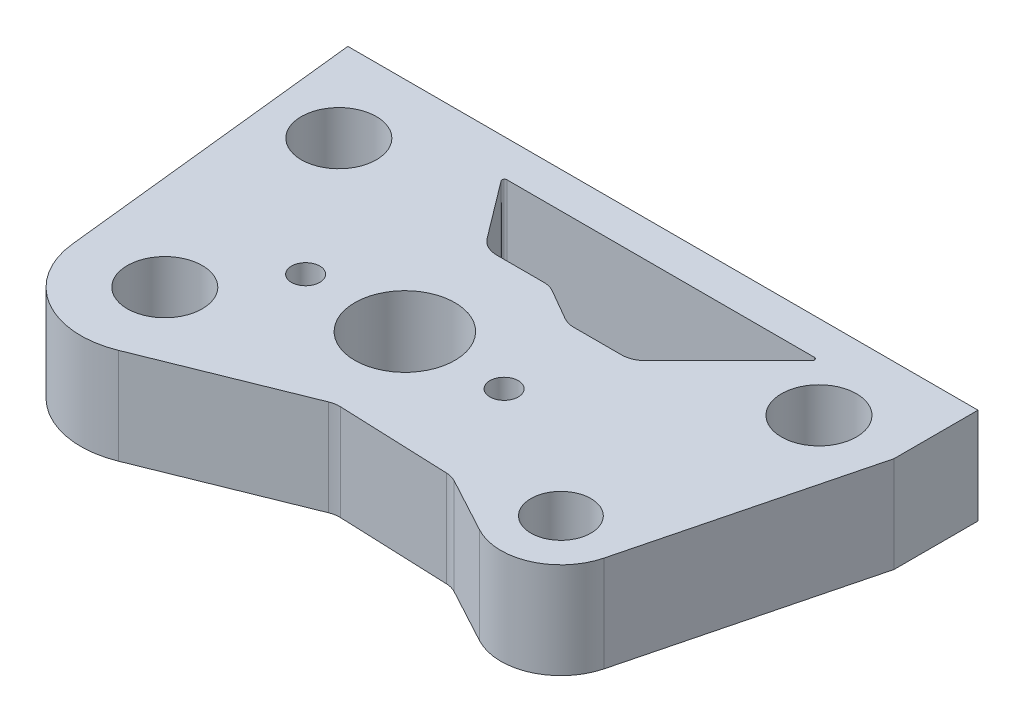
ISO-10303-21;
HEADER;
FILE_DESCRIPTION(('STEP AP214'),'2;1');
FILE_NAME('part.step','',(''),(''),'','','');
FILE_SCHEMA(('AUTOMOTIVE_DESIGN { 1 0 10303 214 1 1 1 1 }'));
ENDSEC;
DATA;
#1=APPLICATION_CONTEXT('core data for automotive mechanical design processes');
#2=APPLICATION_PROTOCOL_DEFINITION('international standard','automotive_design',2000,#1);
#3=PRODUCT_CONTEXT('',#1,'mechanical');
#4=PRODUCT('Part','Part','',(#3));
#5=PRODUCT_RELATED_PRODUCT_CATEGORY('part','',(#4));
#6=PRODUCT_DEFINITION_FORMATION('','',#4);
#7=PRODUCT_DEFINITION_CONTEXT('part definition',#1,'design');
#8=PRODUCT_DEFINITION('design','',#6,#7);
#9=PRODUCT_DEFINITION_SHAPE('','',#8);
#10=(LENGTH_UNIT() NAMED_UNIT(*) SI_UNIT(.MILLI.,.METRE.));
#11=(NAMED_UNIT(*) PLANE_ANGLE_UNIT() SI_UNIT($,.RADIAN.));
#12=(NAMED_UNIT(*) SI_UNIT($,.STERADIAN.) SOLID_ANGLE_UNIT());
#13=UNCERTAINTY_MEASURE_WITH_UNIT(LENGTH_MEASURE(1.E-05),#10,'distance_accuracy_value','');
#14=(GEOMETRIC_REPRESENTATION_CONTEXT(3) GLOBAL_UNCERTAINTY_ASSIGNED_CONTEXT((#13)) GLOBAL_UNIT_ASSIGNED_CONTEXT((#10,
#11,#12)) REPRESENTATION_CONTEXT('',''));
#15=CARTESIAN_POINT('',(0.,0.,0.));
#16=DIRECTION('',(0.,0.,1.));
#17=DIRECTION('',(1.,0.,0.));
#18=AXIS2_PLACEMENT_3D('',#15,#16,#17);
#19=CARTESIAN_POINT('',(0.,10.16,0.));
#20=DIRECTION('',(0.,1.,0.));
#21=DIRECTION('',(0.,0.,1.));
#22=AXIS2_PLACEMENT_3D('',#19,#20,#21);
#23=PLANE('',#22);
#24=CARTESIAN_POINT('',(6.26399999999999,10.16,-8.636));
#25=DIRECTION('',(0.,1.,0.));
#26=DIRECTION('',(0.,0.,1.));
#27=AXIS2_PLACEMENT_3D('',#24,#25,#26);
#28=CIRCLE('',#27,1.5);
#29=CARTESIAN_POINT('',(6.26399999999999,10.16,-7.136));
#30=VERTEX_POINT('',#29);
#31=EDGE_CURVE('E338',#30,#30,#28,.T.);
#32=ORIENTED_EDGE('',*,*,#31,.F.);
#33=EDGE_LOOP('',(#32));
#34=FACE_BOUND('',#33,.T.);
#35=CARTESIAN_POINT('',(27.264,10.16,-8.636));
#36=DIRECTION('',(0.,1.,0.));
#37=DIRECTION('',(0.,0.,1.));
#38=AXIS2_PLACEMENT_3D('',#35,#36,#37);
#39=CIRCLE('',#38,1.5);
#40=CARTESIAN_POINT('',(27.264,10.16,-7.136));
#41=VERTEX_POINT('',#40);
#42=EDGE_CURVE('E354',#41,#41,#39,.T.);
#43=ORIENTED_EDGE('',*,*,#42,.F.);
#44=EDGE_LOOP('',(#43));
#45=FACE_BOUND('',#44,.T.);
#46=CARTESIAN_POINT('',(46.355,10.16,-22.86));
#47=DIRECTION('',(0.,1.,0.));
#48=DIRECTION('',(0.,0.,1.));
#49=AXIS2_PLACEMENT_3D('',#46,#47,#48);
#50=CIRCLE('',#49,3.96874999999998);
#51=CARTESIAN_POINT('',(46.355,10.16,-18.8912500000001));
#52=VERTEX_POINT('',#51);
#53=EDGE_CURVE('E370',#52,#52,#50,.T.);
#54=ORIENTED_EDGE('',*,*,#53,.F.);
#55=EDGE_LOOP('',(#54));
#56=FACE_BOUND('',#55,.T.);
#57=DIRECTION('',(0.,0.,-1.));
#58=VECTOR('',#57,1.);
#59=CARTESIAN_POINT('',(54.2925,10.16,-22.86));
#60=LINE('',#59,#58);
#61=CARTESIAN_POINT('',(54.2925,10.16,-22.86));
#62=VERTEX_POINT('',#61);
#63=CARTESIAN_POINT('',(54.2925,10.16,-31.75));
#64=VERTEX_POINT('',#63);
#65=EDGE_CURVE('E386',#62,#64,#60,.T.);
#66=ORIENTED_EDGE('',*,*,#65,.T.);
#67=DIRECTION('',(-1.,0.,0.));
#68=VECTOR('',#67,1.);
#69=CARTESIAN_POINT('',(54.2925,10.16,-31.75));
#70=LINE('',#69,#68);
#71=CARTESIAN_POINT('',(-12.3825,10.16,-31.75));
#72=VERTEX_POINT('',#71);
#73=EDGE_CURVE('E390',#64,#72,#70,.T.);
#74=ORIENTED_EDGE('',*,*,#73,.T.);
#75=DIRECTION('',(0.107730262404818,0.,0.994180160012354));
#76=VECTOR('',#75,1.);
#77=CARTESIAN_POINT('',(-12.3825,10.16,-31.75));
#78=LINE('',#77,#76);
#79=CARTESIAN_POINT('',(-8.83826162250982,10.16,0.957722032778832));
#80=VERTEX_POINT('',#79);
#81=EDGE_CURVE('E394',#72,#80,#78,.T.);
#82=ORIENTED_EDGE('',*,*,#81,.T.);
#83=CARTESIAN_POINT('',(0.,10.16,0.));
#84=DIRECTION('',(0.,1.,0.));
#85=DIRECTION('',(0.,0.,1.));
#86=AXIS2_PLACEMENT_3D('',#83,#84,#85);
#87=CIRCLE('',#86,8.89);
#88=CARTESIAN_POINT('',(3.32404837472932,10.16,8.24516842777995));
#89=VERTEX_POINT('',#88);
#90=EDGE_CURVE('E397',#80,#89,#87,.T.);
#91=ORIENTED_EDGE('',*,*,#90,.T.);
#92=DIRECTION('',(0.927465514935878,0.,-0.373908703569103));
#93=VECTOR('',#92,1.);
#94=CARTESIAN_POINT('',(19.1913087868326,10.16,1.84826560569164));
#95=LINE('',#94,#93);
#96=CARTESIAN_POINT('',(19.1913087868326,10.16,1.84826560569164));
#97=VERTEX_POINT('',#96);
#98=EDGE_CURVE('E400',#89,#97,#95,.T.);
#99=ORIENTED_EDGE('',*,*,#98,.T.);
#100=CARTESIAN_POINT('',(20.1410368938982,10.16,4.20402801362877));
#101=DIRECTION('',(0.,-1.,0.));
#102=DIRECTION('',(0.,0.,1.));
#103=AXIS2_PLACEMENT_3D('',#100,#101,#102);
#104=CIRCLE('',#103,2.54);
#105=CARTESIAN_POINT('',(20.2409807059541,10.16,1.66599506773707));
#106=VERTEX_POINT('',#105);
#107=EDGE_CURVE('E403',#97,#106,#104,.T.);
#108=ORIENTED_EDGE('',*,*,#107,.T.);
#109=DIRECTION('',(0.999225569248702,0.,0.0393479575023566));
#110=VECTOR('',#109,1.);
#111=CARTESIAN_POINT('',(31.9352523881594,10.16,2.1264974000767));
#112=LINE('',#111,#110);
#113=CARTESIAN_POINT('',(31.9352523881594,10.16,2.1264974000767));
#114=VERTEX_POINT('',#113);
#115=EDGE_CURVE('E406',#106,#114,#112,.T.);
#116=ORIENTED_EDGE('',*,*,#115,.T.);
#117=CARTESIAN_POINT('',(31.8353085761034,10.16,4.66453034596841));
#118=DIRECTION('',(0.,-1.,0.));
#119=DIRECTION('',(0.,0.,1.));
#120=AXIS2_PLACEMENT_3D('',#117,#118,#119);
#121=CIRCLE('',#120,2.54);
#122=CARTESIAN_POINT('',(33.0417417321465,10.16,2.4293303459684));
#123=VERTEX_POINT('',#122);
#124=EDGE_CURVE('E409',#114,#123,#121,.T.);
#125=ORIENTED_EDGE('',*,*,#124,.T.);
#126=DIRECTION('',(0.88,0.,0.474973683481517));
#127=VECTOR('',#126,1.);
#128=CARTESIAN_POINT('',(38.8939171098924,10.16,5.588));
#129=LINE('',#128,#127);
#130=CARTESIAN_POINT('',(38.8939171098924,10.16,5.588));
#131=VERTEX_POINT('',#130);
#132=EDGE_CURVE('E412',#123,#131,#129,.T.);
#133=ORIENTED_EDGE('',*,*,#132,.T.);
#134=CARTESIAN_POINT('',(41.91,10.16,0.));
#135=DIRECTION('',(0.,1.,0.));
#136=DIRECTION('',(0.,0.,1.));
#137=AXIS2_PLACEMENT_3D('',#134,#135,#136);
#138=CIRCLE('',#137,6.35);
#139=CARTESIAN_POINT('',(48.0630980720187,10.16,1.56903923345457));
#140=VERTEX_POINT('',#139);
#141=EDGE_CURVE('E415',#131,#140,#138,.T.);
#142=ORIENTED_EDGE('',*,*,#141,.T.);
#143=DIRECTION('',(0.247092792670011,0.,-0.96899182236515));
#144=VECTOR('',#143,1.);
#145=CARTESIAN_POINT('',(48.0630980720187,10.16,1.56903923345457));
#146=LINE('',#145,#144);
#147=EDGE_CURVE('E418',#140,#62,#146,.T.);
#148=ORIENTED_EDGE('',*,*,#147,.T.);
#149=EDGE_LOOP('',(#66,#74,#82,#91,#99,#108,#116,#125,#133,#142,#148));
#150=FACE_BOUND('',#149,.T.);
#151=CARTESIAN_POINT('',(0.,10.16,0.));
#152=DIRECTION('',(0.,1.,0.));
#153=DIRECTION('',(0.,0.,1.));
#154=AXIS2_PLACEMENT_3D('',#151,#152,#153);
#155=CIRCLE('',#154,3.96875);
#156=CARTESIAN_POINT('',(0.,10.16,3.96875));
#157=VERTEX_POINT('',#156);
#158=EDGE_CURVE('E378',#157,#157,#155,.T.);
#159=ORIENTED_EDGE('',*,*,#158,.F.);
#160=EDGE_LOOP('',(#159));
#161=FACE_BOUND('',#160,.T.);
#162=CARTESIAN_POINT('',(-4.445,10.16,-22.86));
#163=DIRECTION('',(0.,1.,0.));
#164=DIRECTION('',(0.,0.,1.));
#165=AXIS2_PLACEMENT_3D('',#162,#163,#164);
#166=CIRCLE('',#165,3.96875);
#167=CARTESIAN_POINT('',(-4.445,10.16,-18.89125));
#168=VERTEX_POINT('',#167);
#169=EDGE_CURVE('E362',#168,#168,#166,.T.);
#170=ORIENTED_EDGE('',*,*,#169,.F.);
#171=EDGE_LOOP('',(#170));
#172=FACE_BOUND('',#171,.T.);
#173=CARTESIAN_POINT('',(16.764,10.16,-8.636));
#174=DIRECTION('',(0.,1.,0.));
#175=DIRECTION('',(0.,0.,1.));
#176=AXIS2_PLACEMENT_3D('',#173,#174,#175);
#177=CIRCLE('',#176,5.2959);
#178=CARTESIAN_POINT('',(16.764,10.16,-3.3401));
#179=VERTEX_POINT('',#178);
#180=EDGE_CURVE('E346',#179,#179,#177,.T.);
#181=ORIENTED_EDGE('',*,*,#180,.F.);
#182=EDGE_LOOP('',(#181));
#183=FACE_BOUND('',#182,.T.);
#184=CARTESIAN_POINT('',(41.91,10.16,0.));
#185=DIRECTION('',(0.,1.,0.));
#186=DIRECTION('',(0.,0.,1.));
#187=AXIS2_PLACEMENT_3D('',#184,#185,#186);
#188=CIRCLE('',#187,3.175);
#189=CARTESIAN_POINT('',(41.91,10.16,3.175));
#190=VERTEX_POINT('',#189);
#191=EDGE_CURVE('E330',#190,#190,#188,.T.);
#192=ORIENTED_EDGE('',*,*,#191,.F.);
#193=EDGE_LOOP('',(#192));
#194=FACE_BOUND('',#193,.T.);
#195=DIRECTION('',(1.,0.,0.));
#196=VECTOR('',#195,1.);
#197=CARTESIAN_POINT('',(14.6233965672745,10.16,-20.4952795024412));
#198=LINE('',#197,#196);
#199=CARTESIAN_POINT('',(14.6233965672745,10.16,-20.4952795024412));
#200=VERTEX_POINT('',#199);
#201=CARTESIAN_POINT('',(19.5737523811007,10.16,-20.4952795024412));
#202=VERTEX_POINT('',#201);
#203=EDGE_CURVE('E210',#200,#202,#198,.T.);
#204=ORIENTED_EDGE('',*,*,#203,.F.);
#205=CARTESIAN_POINT('',(14.6233965672745,10.16,-23.0352795024412));
#206=DIRECTION('',(0.,1.,0.));
#207=DIRECTION('',(0.,0.,1.));
#208=AXIS2_PLACEMENT_3D('',#205,#206,#207);
#209=CIRCLE('',#208,2.54);
#210=CARTESIAN_POINT('',(12.5948623717544,10.16,-21.506669343635));
#211=VERTEX_POINT('',#210);
#212=EDGE_CURVE('E201',#211,#200,#209,.T.);
#213=ORIENTED_EDGE('',*,*,#212,.F.);
#214=DIRECTION('',(0.601815023152053,0.,0.79863551004729));
#215=VECTOR('',#214,1.);
#216=CARTESIAN_POINT('',(8.05359176634577,10.16,-27.5331389841194));
#217=LINE('',#216,#215);
#218=CARTESIAN_POINT('',(8.05359176634577,10.16,-27.5331389841194));
#219=VERTEX_POINT('',#218);
#220=EDGE_CURVE('E254',#219,#211,#217,.T.);
#221=ORIENTED_EDGE('',*,*,#220,.F.);
#222=CARTESIAN_POINT('',(8.25644518589779,10.16,-27.686));
#223=DIRECTION('',(0.,1.,0.));
#224=DIRECTION('',(0.,0.,1.));
#225=AXIS2_PLACEMENT_3D('',#222,#223,#224);
#226=CIRCLE('',#225,0.254000000000003);
#227=CARTESIAN_POINT('',(8.25644518589779,10.16,-27.94));
#228=VERTEX_POINT('',#227);
#229=EDGE_CURVE('E251',#228,#219,#226,.T.);
#230=ORIENTED_EDGE('',*,*,#229,.F.);
#231=DIRECTION('',(-1.,0.,0.));
#232=VECTOR('',#231,1.);
#233=CARTESIAN_POINT('',(40.7887897551572,10.16,-27.94));
#234=LINE('',#233,#232);
#235=CARTESIAN_POINT('',(40.7887897551572,10.16,-27.94));
#236=VERTEX_POINT('',#235);
#237=EDGE_CURVE('E248',#236,#228,#234,.T.);
#238=ORIENTED_EDGE('',*,*,#237,.F.);
#239=CARTESIAN_POINT('',(40.7887897551572,10.16,-27.686));
#240=DIRECTION('',(0.,1.,0.));
#241=DIRECTION('',(0.,0.,-1.));
#242=AXIS2_PLACEMENT_3D('',#239,#240,#241);
#243=CIRCLE('',#242,0.254000000000001);
#244=CARTESIAN_POINT('',(40.9683948775786,10.16,-27.5063948775786));
#245=VERTEX_POINT('',#244);
#246=EDGE_CURVE('E245',#245,#236,#243,.T.);
#247=ORIENTED_EDGE('',*,*,#246,.F.);
#248=DIRECTION('',(0.707106781186551,0.,-0.707106781186544));
#249=VECTOR('',#248,1.);
#250=CARTESIAN_POINT('',(32.1612282782272,10.16,-18.6992282782273));
#251=LINE('',#250,#249);
#252=CARTESIAN_POINT('',(32.1612282782272,10.16,-18.6992282782273));
#253=VERTEX_POINT('',#252);
#254=EDGE_CURVE('E242',#253,#245,#251,.T.);
#255=ORIENTED_EDGE('',*,*,#254,.F.);
#256=CARTESIAN_POINT('',(30.3651770540134,10.16,-20.4952795024412));
#257=DIRECTION('',(0.,1.,0.));
#258=DIRECTION('',(0.,0.,1.));
#259=AXIS2_PLACEMENT_3D('',#256,#257,#258);
#260=CIRCLE('',#259,2.54);
#261=CARTESIAN_POINT('',(30.3651770540134,10.16,-17.9552795024412));
#262=VERTEX_POINT('',#261);
#263=EDGE_CURVE('E239',#262,#253,#260,.T.);
#264=ORIENTED_EDGE('',*,*,#263,.F.);
#265=DIRECTION('',(1.,0.,0.));
#266=VECTOR('',#265,1.);
#267=CARTESIAN_POINT('',(25.3343433298758,10.16,-17.9552795024412));
#268=LINE('',#267,#266);
#269=CARTESIAN_POINT('',(25.3343433298758,10.16,-17.9552795024412));
#270=VERTEX_POINT('',#269);
#271=EDGE_CURVE('E236',#270,#262,#268,.T.);
#272=ORIENTED_EDGE('',*,*,#271,.F.);
#273=CARTESIAN_POINT('',(25.3343433298758,10.16,-20.4952795024412));
#274=DIRECTION('',(0.,1.,0.));
#275=DIRECTION('',(0.,0.,1.));
#276=AXIS2_PLACEMENT_3D('',#273,#274,#275);
#277=CIRCLE('',#276,2.54);
#278=CARTESIAN_POINT('',(24.0643433298758,10.16,-18.2955749768287));
#279=VERTEX_POINT('',#278);
#280=EDGE_CURVE('E233',#279,#270,#277,.T.);
#281=ORIENTED_EDGE('',*,*,#280,.F.);
#282=DIRECTION('',(0.866025403784438,0.,0.500000000000001));
#283=VECTOR('',#282,1.);
#284=CARTESIAN_POINT('',(20.8437523811007,10.16,-20.1549840280536));
#285=LINE('',#284,#283);
#286=CARTESIAN_POINT('',(20.8437523811007,10.16,-20.1549840280536));
#287=VERTEX_POINT('',#286);
#288=EDGE_CURVE('E228',#287,#279,#285,.T.);
#289=ORIENTED_EDGE('',*,*,#288,.F.);
#290=CARTESIAN_POINT('',(19.5737523811007,10.16,-17.9552795024412));
#291=DIRECTION('',(0.,-1.,0.));
#292=DIRECTION('',(0.,0.,-1.));
#293=AXIS2_PLACEMENT_3D('',#290,#291,#292);
#294=CIRCLE('',#293,2.54);
#295=EDGE_CURVE('E224',#202,#287,#294,.T.);
#296=ORIENTED_EDGE('',*,*,#295,.F.);
#297=EDGE_LOOP('',(#204,#213,#221,#230,#238,#247,#255,#264,#272,#281,#289,#296));
#298=FACE_BOUND('',#297,.T.);
#299=ADVANCED_FACE('F45',(#34,#45,#56,#150,#161,#172,#183,#194,#298),#23,.T.);
#300=CARTESIAN_POINT('',(0.,0.,0.));
#301=DIRECTION('',(0.,1.,0.));
#302=DIRECTION('',(0.,0.,1.));
#303=AXIS2_PLACEMENT_3D('',#300,#301,#302);
#304=PLANE('',#303);
#305=CARTESIAN_POINT('',(41.91,0.,0.));
#306=DIRECTION('',(0.,1.,0.));
#307=DIRECTION('',(0.,0.,1.));
#308=AXIS2_PLACEMENT_3D('',#305,#306,#307);
#309=CIRCLE('',#308,3.175);
#310=CARTESIAN_POINT('',(41.91,0.,3.175));
#311=VERTEX_POINT('',#310);
#312=EDGE_CURVE('E219',#311,#311,#309,.T.);
#313=ORIENTED_EDGE('',*,*,#312,.T.);
#314=EDGE_LOOP('',(#313));
#315=FACE_BOUND('',#314,.T.);
#316=CARTESIAN_POINT('',(6.26399999999999,0.,-8.636));
#317=DIRECTION('',(0.,1.,0.));
#318=DIRECTION('',(0.,0.,1.));
#319=AXIS2_PLACEMENT_3D('',#316,#317,#318);
#320=CIRCLE('',#319,1.5);
#321=CARTESIAN_POINT('',(6.26399999999999,0.,-7.136));
#322=VERTEX_POINT('',#321);
#323=EDGE_CURVE('E334',#322,#322,#320,.T.);
#324=ORIENTED_EDGE('',*,*,#323,.T.);
#325=EDGE_LOOP('',(#324));
#326=FACE_BOUND('',#325,.T.);
#327=CARTESIAN_POINT('',(16.764,0.,-8.636));
#328=DIRECTION('',(0.,1.,0.));
#329=DIRECTION('',(0.,0.,1.));
#330=AXIS2_PLACEMENT_3D('',#327,#328,#329);
#331=CIRCLE('',#330,5.2959);
#332=CARTESIAN_POINT('',(16.764,0.,-3.3401));
#333=VERTEX_POINT('',#332);
#334=EDGE_CURVE('E342',#333,#333,#331,.T.);
#335=ORIENTED_EDGE('',*,*,#334,.T.);
#336=EDGE_LOOP('',(#335));
#337=FACE_BOUND('',#336,.T.);
#338=CARTESIAN_POINT('',(27.264,0.,-8.636));
#339=DIRECTION('',(0.,1.,0.));
#340=DIRECTION('',(0.,0.,1.));
#341=AXIS2_PLACEMENT_3D('',#338,#339,#340);
#342=CIRCLE('',#341,1.5);
#343=CARTESIAN_POINT('',(27.264,0.,-7.136));
#344=VERTEX_POINT('',#343);
#345=EDGE_CURVE('E350',#344,#344,#342,.T.);
#346=ORIENTED_EDGE('',*,*,#345,.T.);
#347=EDGE_LOOP('',(#346));
#348=FACE_BOUND('',#347,.T.);
#349=CARTESIAN_POINT('',(-4.445,0.,-22.86));
#350=DIRECTION('',(0.,1.,0.));
#351=DIRECTION('',(0.,0.,1.));
#352=AXIS2_PLACEMENT_3D('',#349,#350,#351);
#353=CIRCLE('',#352,3.96875);
#354=CARTESIAN_POINT('',(-4.445,0.,-18.89125));
#355=VERTEX_POINT('',#354);
#356=EDGE_CURVE('E358',#355,#355,#353,.T.);
#357=ORIENTED_EDGE('',*,*,#356,.T.);
#358=EDGE_LOOP('',(#357));
#359=FACE_BOUND('',#358,.T.);
#360=CARTESIAN_POINT('',(46.355,0.,-22.86));
#361=DIRECTION('',(0.,1.,0.));
#362=DIRECTION('',(0.,0.,1.));
#363=AXIS2_PLACEMENT_3D('',#360,#361,#362);
#364=CIRCLE('',#363,3.96874999999998);
#365=CARTESIAN_POINT('',(46.355,0.,-18.8912500000001));
#366=VERTEX_POINT('',#365);
#367=EDGE_CURVE('E366',#366,#366,#364,.T.);
#368=ORIENTED_EDGE('',*,*,#367,.T.);
#369=EDGE_LOOP('',(#368));
#370=FACE_BOUND('',#369,.T.);
#371=CARTESIAN_POINT('',(0.,0.,0.));
#372=DIRECTION('',(0.,1.,0.));
#373=DIRECTION('',(0.,0.,1.));
#374=AXIS2_PLACEMENT_3D('',#371,#372,#373);
#375=CIRCLE('',#374,3.96875);
#376=CARTESIAN_POINT('',(0.,0.,3.96875));
#377=VERTEX_POINT('',#376);
#378=EDGE_CURVE('E374',#377,#377,#375,.T.);
#379=ORIENTED_EDGE('',*,*,#378,.T.);
#380=EDGE_LOOP('',(#379));
#381=FACE_BOUND('',#380,.T.);
#382=DIRECTION('',(0.,0.,-1.));
#383=VECTOR('',#382,1.);
#384=CARTESIAN_POINT('',(54.2925,0.,-22.86));
#385=LINE('',#384,#383);
#386=CARTESIAN_POINT('',(54.2925,0.,-22.86));
#387=VERTEX_POINT('',#386);
#388=CARTESIAN_POINT('',(54.2925,0.,-31.75));
#389=VERTEX_POINT('',#388);
#390=EDGE_CURVE('E382',#387,#389,#385,.T.);
#391=ORIENTED_EDGE('',*,*,#390,.F.);
#392=DIRECTION('',(0.247092792670011,0.,-0.96899182236515));
#393=VECTOR('',#392,1.);
#394=CARTESIAN_POINT('',(48.0630980720187,0.,1.56903923345457));
#395=LINE('',#394,#393);
#396=CARTESIAN_POINT('',(48.0630980720187,0.,1.56903923345457));
#397=VERTEX_POINT('',#396);
#398=EDGE_CURVE('E391',#397,#387,#395,.T.);
#399=ORIENTED_EDGE('',*,*,#398,.F.);
#400=CARTESIAN_POINT('',(41.91,0.,0.));
#401=DIRECTION('',(0.,1.,0.));
#402=DIRECTION('',(0.,0.,1.));
#403=AXIS2_PLACEMENT_3D('',#400,#401,#402);
#404=CIRCLE('',#403,6.35);
#405=CARTESIAN_POINT('',(38.8939171098924,0.,5.588));
#406=VERTEX_POINT('',#405);
#407=EDGE_CURVE('E449',#406,#397,#404,.T.);
#408=ORIENTED_EDGE('',*,*,#407,.F.);
#409=DIRECTION('',(0.88,0.,0.474973683481517));
#410=VECTOR('',#409,1.);
#411=CARTESIAN_POINT('',(38.8939171098924,0.,5.588));
#412=LINE('',#411,#410);
#413=CARTESIAN_POINT('',(33.0417417321465,0.,2.4293303459684));
#414=VERTEX_POINT('',#413);
#415=EDGE_CURVE('E446',#414,#406,#412,.T.);
#416=ORIENTED_EDGE('',*,*,#415,.F.);
#417=CARTESIAN_POINT('',(31.8353085761034,0.,4.66453034596841));
#418=DIRECTION('',(0.,-1.,0.));
#419=DIRECTION('',(0.,0.,1.));
#420=AXIS2_PLACEMENT_3D('',#417,#418,#419);
#421=CIRCLE('',#420,2.54);
#422=CARTESIAN_POINT('',(31.9352523881594,0.,2.1264974000767));
#423=VERTEX_POINT('',#422);
#424=EDGE_CURVE('E443',#423,#414,#421,.T.);
#425=ORIENTED_EDGE('',*,*,#424,.F.);
#426=DIRECTION('',(0.999225569248702,0.,0.0393479575023566));
#427=VECTOR('',#426,1.);
#428=CARTESIAN_POINT('',(31.9352523881594,0.,2.1264974000767));
#429=LINE('',#428,#427);
#430=CARTESIAN_POINT('',(20.2409807059541,0.,1.66599506773707));
#431=VERTEX_POINT('',#430);
#432=EDGE_CURVE('E440',#431,#423,#429,.T.);
#433=ORIENTED_EDGE('',*,*,#432,.F.);
#434=CARTESIAN_POINT('',(20.1410368938982,0.,4.20402801362877));
#435=DIRECTION('',(0.,-1.,0.));
#436=DIRECTION('',(0.,0.,1.));
#437=AXIS2_PLACEMENT_3D('',#434,#435,#436);
#438=CIRCLE('',#437,2.54);
#439=CARTESIAN_POINT('',(19.1913087868326,0.,1.84826560569164));
#440=VERTEX_POINT('',#439);
#441=EDGE_CURVE('E437',#440,#431,#438,.T.);
#442=ORIENTED_EDGE('',*,*,#441,.F.);
#443=DIRECTION('',(0.927465514935878,0.,-0.373908703569103));
#444=VECTOR('',#443,1.);
#445=CARTESIAN_POINT('',(19.1913087868326,0.,1.84826560569164));
#446=LINE('',#445,#444);
#447=CARTESIAN_POINT('',(3.32404837472932,0.,8.24516842777995));
#448=VERTEX_POINT('',#447);
#449=EDGE_CURVE('E434',#448,#440,#446,.T.);
#450=ORIENTED_EDGE('',*,*,#449,.F.);
#451=CARTESIAN_POINT('',(0.,0.,0.));
#452=DIRECTION('',(0.,1.,0.));
#453=DIRECTION('',(0.,0.,1.));
#454=AXIS2_PLACEMENT_3D('',#451,#452,#453);
#455=CIRCLE('',#454,8.89);
#456=CARTESIAN_POINT('',(-8.83826162250982,0.,0.957722032778832));
#457=VERTEX_POINT('',#456);
#458=EDGE_CURVE('E431',#457,#448,#455,.T.);
#459=ORIENTED_EDGE('',*,*,#458,.F.);
#460=DIRECTION('',(0.107730262404818,0.,0.994180160012354));
#461=VECTOR('',#460,1.);
#462=CARTESIAN_POINT('',(-12.3825,0.,-31.75));
#463=LINE('',#462,#461);
#464=CARTESIAN_POINT('',(-12.3825,0.,-31.75));
#465=VERTEX_POINT('',#464);
#466=EDGE_CURVE('E428',#465,#457,#463,.T.);
#467=ORIENTED_EDGE('',*,*,#466,.F.);
#468=DIRECTION('',(-1.,0.,0.));
#469=VECTOR('',#468,1.);
#470=CARTESIAN_POINT('',(54.2925,0.,-31.75));
#471=LINE('',#470,#469);
#472=EDGE_CURVE('E425',#389,#465,#471,.T.);
#473=ORIENTED_EDGE('',*,*,#472,.F.);
#474=EDGE_LOOP('',(#391,#399,#408,#416,#425,#433,#442,#450,#459,#467,#473));
#475=FACE_BOUND('',#474,.T.);
#476=CARTESIAN_POINT('',(14.6233965672745,0.,-23.0352795024412));
#477=DIRECTION('',(0.,1.,0.));
#478=DIRECTION('',(0.,0.,1.));
#479=AXIS2_PLACEMENT_3D('',#476,#477,#478);
#480=CIRCLE('',#479,2.54);
#481=CARTESIAN_POINT('',(12.5948623717544,0.,-21.5066693436349));
#482=VERTEX_POINT('',#481);
#483=CARTESIAN_POINT('',(14.6233965672745,0.,-20.4952795024412));
#484=VERTEX_POINT('',#483);
#485=EDGE_CURVE('E69',#482,#484,#480,.T.);
#486=ORIENTED_EDGE('',*,*,#485,.T.);
#487=DIRECTION('',(1.,0.,0.));
#488=VECTOR('',#487,1.);
#489=CARTESIAN_POINT('',(14.6233965672745,0.,-20.4952795024412));
#490=LINE('',#489,#488);
#491=CARTESIAN_POINT('',(19.5737523811007,0.,-20.4952795024412));
#492=VERTEX_POINT('',#491);
#493=EDGE_CURVE('E217',#484,#492,#490,.T.);
#494=ORIENTED_EDGE('',*,*,#493,.T.);
#495=CARTESIAN_POINT('',(19.5737523811007,0.,-17.9552795024412));
#496=DIRECTION('',(0.,-1.,0.));
#497=DIRECTION('',(0.,0.,-1.));
#498=AXIS2_PLACEMENT_3D('',#495,#496,#497);
#499=CIRCLE('',#498,2.54);
#500=CARTESIAN_POINT('',(20.8437523811007,0.,-20.1549840280536));
#501=VERTEX_POINT('',#500);
#502=EDGE_CURVE('E261',#492,#501,#499,.T.);
#503=ORIENTED_EDGE('',*,*,#502,.T.);
#504=DIRECTION('',(0.866025403784438,0.,0.500000000000001));
#505=VECTOR('',#504,1.);
#506=CARTESIAN_POINT('',(20.8437523811007,0.,-20.1549840280536));
#507=LINE('',#506,#505);
#508=CARTESIAN_POINT('',(24.0643433298758,0.,-18.2955749768287));
#509=VERTEX_POINT('',#508);
#510=EDGE_CURVE('E265',#501,#509,#507,.T.);
#511=ORIENTED_EDGE('',*,*,#510,.T.);
#512=CARTESIAN_POINT('',(25.3343433298758,0.,-20.4952795024412));
#513=DIRECTION('',(0.,1.,0.));
#514=DIRECTION('',(0.,0.,1.));
#515=AXIS2_PLACEMENT_3D('',#512,#513,#514);
#516=CIRCLE('',#515,2.54);
#517=CARTESIAN_POINT('',(25.3343433298758,0.,-17.9552795024412));
#518=VERTEX_POINT('',#517);
#519=EDGE_CURVE('E269',#509,#518,#516,.T.);
#520=ORIENTED_EDGE('',*,*,#519,.T.);
#521=DIRECTION('',(1.,0.,0.));
#522=VECTOR('',#521,1.);
#523=CARTESIAN_POINT('',(25.3343433298758,0.,-17.9552795024412));
#524=LINE('',#523,#522);
#525=CARTESIAN_POINT('',(30.3651770540134,0.,-17.9552795024412));
#526=VERTEX_POINT('',#525);
#527=EDGE_CURVE('E273',#518,#526,#524,.T.);
#528=ORIENTED_EDGE('',*,*,#527,.T.);
#529=CARTESIAN_POINT('',(30.3651770540134,0.,-20.4952795024412));
#530=DIRECTION('',(0.,1.,0.));
#531=DIRECTION('',(0.,0.,1.));
#532=AXIS2_PLACEMENT_3D('',#529,#530,#531);
#533=CIRCLE('',#532,2.54);
#534=CARTESIAN_POINT('',(32.1612282782272,0.,-18.6992282782273));
#535=VERTEX_POINT('',#534);
#536=EDGE_CURVE('E277',#526,#535,#533,.T.);
#537=ORIENTED_EDGE('',*,*,#536,.T.);
#538=DIRECTION('',(0.707106781186551,0.,-0.707106781186544));
#539=VECTOR('',#538,1.);
#540=CARTESIAN_POINT('',(32.1612282782272,0.,-18.6992282782273));
#541=LINE('',#540,#539);
#542=CARTESIAN_POINT('',(40.9683948775786,0.,-27.5063948775786));
#543=VERTEX_POINT('',#542);
#544=EDGE_CURVE('E281',#535,#543,#541,.T.);
#545=ORIENTED_EDGE('',*,*,#544,.T.);
#546=CARTESIAN_POINT('',(40.7887897551572,0.,-27.686));
#547=DIRECTION('',(0.,1.,0.));
#548=DIRECTION('',(0.,0.,-1.));
#549=AXIS2_PLACEMENT_3D('',#546,#547,#548);
#550=CIRCLE('',#549,0.254000000000001);
#551=CARTESIAN_POINT('',(40.7887897551572,0.,-27.94));
#552=VERTEX_POINT('',#551);
#553=EDGE_CURVE('E285',#543,#552,#550,.T.);
#554=ORIENTED_EDGE('',*,*,#553,.T.);
#555=DIRECTION('',(-1.,0.,0.));
#556=VECTOR('',#555,1.);
#557=CARTESIAN_POINT('',(40.7887897551572,0.,-27.94));
#558=LINE('',#557,#556);
#559=CARTESIAN_POINT('',(8.25644518589779,0.,-27.94));
#560=VERTEX_POINT('',#559);
#561=EDGE_CURVE('E289',#552,#560,#558,.T.);
#562=ORIENTED_EDGE('',*,*,#561,.T.);
#563=CARTESIAN_POINT('',(8.25644518589779,0.,-27.686));
#564=DIRECTION('',(0.,1.,0.));
#565=DIRECTION('',(0.,0.,1.));
#566=AXIS2_PLACEMENT_3D('',#563,#564,#565);
#567=CIRCLE('',#566,0.254000000000003);
#568=CARTESIAN_POINT('',(8.05359176634577,0.,-27.5331389841194));
#569=VERTEX_POINT('',#568);
#570=EDGE_CURVE('E293',#560,#569,#567,.T.);
#571=ORIENTED_EDGE('',*,*,#570,.T.);
#572=DIRECTION('',(0.601815023152053,0.,0.79863551004729));
#573=VECTOR('',#572,1.);
#574=CARTESIAN_POINT('',(8.05359176634577,0.,-27.5331389841194));
#575=LINE('',#574,#573);
#576=EDGE_CURVE('E211',#569,#482,#575,.T.);
#577=ORIENTED_EDGE('',*,*,#576,.T.);
#578=EDGE_LOOP('',(#486,#494,#503,#511,#520,#528,#537,#545,#554,#562,#571,#577));
#579=FACE_BOUND('',#578,.T.);
#580=ADVANCED_FACE('F500',(#315,#326,#337,#348,#359,#370,#381,#475,#579),#304,.F.);
#581=CARTESIAN_POINT('',(54.2925,10.16,-22.86));
#582=DIRECTION('',(-1.,0.,0.));
#583=DIRECTION('',(0.,0.,1.));
#584=AXIS2_PLACEMENT_3D('',#581,#582,#583);
#585=PLANE('',#584);
#586=ORIENTED_EDGE('',*,*,#390,.T.);
#587=DIRECTION('',(0.,-1.,0.));
#588=VECTOR('',#587,1.);
#589=CARTESIAN_POINT('',(54.2925,10.16,-31.75));
#590=LINE('',#589,#588);
#591=EDGE_CURVE('E11',#64,#389,#590,.T.);
#592=ORIENTED_EDGE('',*,*,#591,.F.);
#593=ORIENTED_EDGE('',*,*,#65,.F.);
#594=DIRECTION('',(0.,-1.,0.));
#595=VECTOR('',#594,1.);
#596=CARTESIAN_POINT('',(54.2925,10.16,-22.86));
#597=LINE('',#596,#595);
#598=EDGE_CURVE('E421',#62,#387,#597,.T.);
#599=ORIENTED_EDGE('',*,*,#598,.T.);
#600=EDGE_LOOP('',(#586,#592,#593,#599));
#601=FACE_BOUND('',#600,.T.);
#602=ADVANCED_FACE('F47',(#601),#585,.F.);
#603=CARTESIAN_POINT('',(54.2925,10.16,-31.75));
#604=DIRECTION('',(0.,0.,1.));
#605=DIRECTION('',(1.,0.,0.));
#606=AXIS2_PLACEMENT_3D('',#603,#604,#605);
#607=PLANE('',#606);
#608=ORIENTED_EDGE('',*,*,#472,.T.);
#609=DIRECTION('',(0.,-1.,0.));
#610=VECTOR('',#609,1.);
#611=CARTESIAN_POINT('',(-12.3825,10.16,-31.75));
#612=LINE('',#611,#610);
#613=EDGE_CURVE('E54',#72,#465,#612,.T.);
#614=ORIENTED_EDGE('',*,*,#613,.F.);
#615=ORIENTED_EDGE('',*,*,#73,.F.);
#616=ORIENTED_EDGE('',*,*,#591,.T.);
#617=EDGE_LOOP('',(#608,#614,#615,#616));
#618=FACE_BOUND('',#617,.T.);
#619=ADVANCED_FACE('F518',(#618),#607,.F.);
#620=CARTESIAN_POINT('',(-12.3825,10.16,-31.75));
#621=DIRECTION('',(0.994180160012354,0.,-0.107730262404818));
#622=DIRECTION('',(-0.107730262404818,0.,-0.994180160012354));
#623=AXIS2_PLACEMENT_3D('',#620,#621,#622);
#624=PLANE('',#623);
#625=ORIENTED_EDGE('',*,*,#466,.T.);
#626=DIRECTION('',(0.,-1.,0.));
#627=VECTOR('',#626,1.);
#628=CARTESIAN_POINT('',(-8.83826162250982,10.16,0.957722032778832));
#629=LINE('',#628,#627);
#630=EDGE_CURVE('E485',#80,#457,#629,.T.);
#631=ORIENTED_EDGE('',*,*,#630,.F.);
#632=ORIENTED_EDGE('',*,*,#81,.F.);
#633=ORIENTED_EDGE('',*,*,#613,.T.);
#634=EDGE_LOOP('',(#625,#631,#632,#633));
#635=FACE_BOUND('',#634,.T.);
#636=ADVANCED_FACE('F494',(#635),#624,.F.);
#637=CARTESIAN_POINT('',(0.,10.16,0.));
#638=DIRECTION('',(0.,-1.,0.));
#639=DIRECTION('',(0.,0.,-1.));
#640=AXIS2_PLACEMENT_3D('',#637,#638,#639);
#641=CYLINDRICAL_SURFACE('',#640,8.89);
#642=ORIENTED_EDGE('',*,*,#458,.T.);
#643=DIRECTION('',(0.,-1.,0.));
#644=VECTOR('',#643,1.);
#645=CARTESIAN_POINT('',(3.32404837472932,10.16,8.24516842777995));
#646=LINE('',#645,#644);
#647=EDGE_CURVE('E481',#89,#448,#646,.T.);
#648=ORIENTED_EDGE('',*,*,#647,.F.);
#649=ORIENTED_EDGE('',*,*,#90,.F.);
#650=ORIENTED_EDGE('',*,*,#630,.T.);
#651=EDGE_LOOP('',(#642,#648,#649,#650));
#652=FACE_BOUND('',#651,.T.);
#653=ADVANCED_FACE('F506',(#652),#641,.T.);
#654=CARTESIAN_POINT('',(19.1913087868326,10.16,1.84826560569164));
#655=DIRECTION('',(-0.373908703569103,0.,-0.927465514935878));
#656=DIRECTION('',(-0.927465514935878,0.,0.373908703569103));
#657=AXIS2_PLACEMENT_3D('',#654,#655,#656);
#658=PLANE('',#657);
#659=ORIENTED_EDGE('',*,*,#449,.T.);
#660=DIRECTION('',(0.,-1.,0.));
#661=VECTOR('',#660,1.);
#662=CARTESIAN_POINT('',(19.1913087868326,10.16,1.84826560569164));
#663=LINE('',#662,#661);
#664=EDGE_CURVE('E477',#97,#440,#663,.T.);
#665=ORIENTED_EDGE('',*,*,#664,.F.);
#666=ORIENTED_EDGE('',*,*,#98,.F.);
#667=ORIENTED_EDGE('',*,*,#647,.T.);
#668=EDGE_LOOP('',(#659,#665,#666,#667));
#669=FACE_BOUND('',#668,.T.);
#670=ADVANCED_FACE('F510',(#669),#658,.F.);
#671=CARTESIAN_POINT('',(20.1410368938982,10.16,4.20402801362877));
#672=DIRECTION('',(0.,-1.,0.));
#673=DIRECTION('',(0.,0.,-1.));
#674=AXIS2_PLACEMENT_3D('',#671,#672,#673);
#675=CYLINDRICAL_SURFACE('',#674,2.54);
#676=ORIENTED_EDGE('',*,*,#441,.T.);
#677=DIRECTION('',(0.,-1.,0.));
#678=VECTOR('',#677,1.);
#679=CARTESIAN_POINT('',(20.2409807059541,10.16,1.66599506773707));
#680=LINE('',#679,#678);
#681=EDGE_CURVE('E473',#106,#431,#680,.T.);
#682=ORIENTED_EDGE('',*,*,#681,.F.);
#683=ORIENTED_EDGE('',*,*,#107,.F.);
#684=ORIENTED_EDGE('',*,*,#664,.T.);
#685=EDGE_LOOP('',(#676,#682,#683,#684));
#686=FACE_BOUND('',#685,.T.);
#687=ADVANCED_FACE('F546',(#686),#675,.F.);
#688=CARTESIAN_POINT('',(31.9352523881594,10.16,2.1264974000767));
#689=DIRECTION('',(0.0393479575023566,0.,-0.999225569248702));
#690=DIRECTION('',(-0.999225569248702,0.,-0.0393479575023566));
#691=AXIS2_PLACEMENT_3D('',#688,#689,#690);
#692=PLANE('',#691);
#693=ORIENTED_EDGE('',*,*,#432,.T.);
#694=DIRECTION('',(0.,-1.,0.));
#695=VECTOR('',#694,1.);
#696=CARTESIAN_POINT('',(31.9352523881594,10.16,2.1264974000767));
#697=LINE('',#696,#695);
#698=EDGE_CURVE('E469',#114,#423,#697,.T.);
#699=ORIENTED_EDGE('',*,*,#698,.F.);
#700=ORIENTED_EDGE('',*,*,#115,.F.);
#701=ORIENTED_EDGE('',*,*,#681,.T.);
#702=EDGE_LOOP('',(#693,#699,#700,#701));
#703=FACE_BOUND('',#702,.T.);
#704=ADVANCED_FACE('F544',(#703),#692,.F.);
#705=CARTESIAN_POINT('',(31.8353085761034,10.16,4.66453034596841));
#706=DIRECTION('',(0.,-1.,0.));
#707=DIRECTION('',(0.,0.,-1.));
#708=AXIS2_PLACEMENT_3D('',#705,#706,#707);
#709=CYLINDRICAL_SURFACE('',#708,2.54);
#710=ORIENTED_EDGE('',*,*,#424,.T.);
#711=DIRECTION('',(0.,-1.,0.));
#712=VECTOR('',#711,1.);
#713=CARTESIAN_POINT('',(33.0417417321465,10.16,2.4293303459684));
#714=LINE('',#713,#712);
#715=EDGE_CURVE('E465',#123,#414,#714,.T.);
#716=ORIENTED_EDGE('',*,*,#715,.F.);
#717=ORIENTED_EDGE('',*,*,#124,.F.);
#718=ORIENTED_EDGE('',*,*,#698,.T.);
#719=EDGE_LOOP('',(#710,#716,#717,#718));
#720=FACE_BOUND('',#719,.T.);
#721=ADVANCED_FACE('F539',(#720),#709,.F.);
#722=CARTESIAN_POINT('',(38.8939171098924,10.16,5.588));
#723=DIRECTION('',(0.474973683481517,0.,-0.88));
#724=DIRECTION('',(-0.88,0.,-0.474973683481517));
#725=AXIS2_PLACEMENT_3D('',#722,#723,#724);
#726=PLANE('',#725);
#727=ORIENTED_EDGE('',*,*,#415,.T.);
#728=DIRECTION('',(0.,-1.,0.));
#729=VECTOR('',#728,1.);
#730=CARTESIAN_POINT('',(38.8939171098924,10.16,5.588));
#731=LINE('',#730,#729);
#732=EDGE_CURVE('E461',#131,#406,#731,.T.);
#733=ORIENTED_EDGE('',*,*,#732,.F.);
#734=ORIENTED_EDGE('',*,*,#132,.F.);
#735=ORIENTED_EDGE('',*,*,#715,.T.);
#736=EDGE_LOOP('',(#727,#733,#734,#735));
#737=FACE_BOUND('',#736,.T.);
#738=ADVANCED_FACE('F534',(#737),#726,.F.);
#739=CARTESIAN_POINT('',(41.91,10.16,0.));
#740=DIRECTION('',(0.,-1.,0.));
#741=DIRECTION('',(0.,0.,-1.));
#742=AXIS2_PLACEMENT_3D('',#739,#740,#741);
#743=CYLINDRICAL_SURFACE('',#742,6.35);
#744=ORIENTED_EDGE('',*,*,#407,.T.);
#745=DIRECTION('',(0.,-1.,0.));
#746=VECTOR('',#745,1.);
#747=CARTESIAN_POINT('',(48.0630980720187,10.16,1.56903923345457));
#748=LINE('',#747,#746);
#749=EDGE_CURVE('E457',#140,#397,#748,.T.);
#750=ORIENTED_EDGE('',*,*,#749,.F.);
#751=ORIENTED_EDGE('',*,*,#141,.F.);
#752=ORIENTED_EDGE('',*,*,#732,.T.);
#753=EDGE_LOOP('',(#744,#750,#751,#752));
#754=FACE_BOUND('',#753,.T.);
#755=ADVANCED_FACE('F530',(#754),#743,.T.);
#756=CARTESIAN_POINT('',(48.0630980720187,10.16,1.56903923345457));
#757=DIRECTION('',(-0.96899182236515,0.,-0.247092792670011));
#758=DIRECTION('',(-0.247092792670011,0.,0.96899182236515));
#759=AXIS2_PLACEMENT_3D('',#756,#757,#758);
#760=PLANE('',#759);
#761=ORIENTED_EDGE('',*,*,#398,.T.);
#762=ORIENTED_EDGE('',*,*,#598,.F.);
#763=ORIENTED_EDGE('',*,*,#147,.F.);
#764=ORIENTED_EDGE('',*,*,#749,.T.);
#765=EDGE_LOOP('',(#761,#762,#763,#764));
#766=FACE_BOUND('',#765,.T.);
#767=ADVANCED_FACE('F525',(#766),#760,.F.);
#768=CARTESIAN_POINT('',(0.,10.16,0.));
#769=DIRECTION('',(0.,-1.,0.));
#770=DIRECTION('',(0.,0.,-1.));
#771=AXIS2_PLACEMENT_3D('',#768,#769,#770);
#772=CYLINDRICAL_SURFACE('',#771,3.96875);
#773=ORIENTED_EDGE('',*,*,#158,.T.);
#774=EDGE_LOOP('',(#773));
#775=FACE_BOUND('',#774,.T.);
#776=ORIENTED_EDGE('',*,*,#378,.F.);
#777=EDGE_LOOP('',(#776));
#778=FACE_BOUND('',#777,.T.);
#779=ADVANCED_FACE('F566',(#775,#778),#772,.F.);
#780=CARTESIAN_POINT('',(46.355,10.16,-22.86));
#781=DIRECTION('',(0.,-1.,0.));
#782=DIRECTION('',(0.,0.,-1.));
#783=AXIS2_PLACEMENT_3D('',#780,#781,#782);
#784=CYLINDRICAL_SURFACE('',#783,3.96874999999998);
#785=ORIENTED_EDGE('',*,*,#53,.T.);
#786=EDGE_LOOP('',(#785));
#787=FACE_BOUND('',#786,.T.);
#788=ORIENTED_EDGE('',*,*,#367,.F.);
#789=EDGE_LOOP('',(#788));
#790=FACE_BOUND('',#789,.T.);
#791=ADVANCED_FACE('F598',(#787,#790),#784,.F.);
#792=CARTESIAN_POINT('',(-4.445,10.16,-22.86));
#793=DIRECTION('',(0.,-1.,0.));
#794=DIRECTION('',(0.,0.,-1.));
#795=AXIS2_PLACEMENT_3D('',#792,#793,#794);
#796=CYLINDRICAL_SURFACE('',#795,3.96875);
#797=ORIENTED_EDGE('',*,*,#169,.T.);
#798=EDGE_LOOP('',(#797));
#799=FACE_BOUND('',#798,.T.);
#800=ORIENTED_EDGE('',*,*,#356,.F.);
#801=EDGE_LOOP('',(#800));
#802=FACE_BOUND('',#801,.T.);
#803=ADVANCED_FACE('F605',(#799,#802),#796,.F.);
#804=CARTESIAN_POINT('',(27.264,10.16,-8.636));
#805=DIRECTION('',(0.,-1.,0.));
#806=DIRECTION('',(0.,0.,-1.));
#807=AXIS2_PLACEMENT_3D('',#804,#805,#806);
#808=CYLINDRICAL_SURFACE('',#807,1.5);
#809=ORIENTED_EDGE('',*,*,#42,.T.);
#810=EDGE_LOOP('',(#809));
#811=FACE_BOUND('',#810,.T.);
#812=ORIENTED_EDGE('',*,*,#345,.F.);
#813=EDGE_LOOP('',(#812));
#814=FACE_BOUND('',#813,.T.);
#815=ADVANCED_FACE('F612',(#811,#814),#808,.F.);
#816=CARTESIAN_POINT('',(16.764,10.16,-8.636));
#817=DIRECTION('',(0.,-1.,0.));
#818=DIRECTION('',(0.,0.,-1.));
#819=AXIS2_PLACEMENT_3D('',#816,#817,#818);
#820=CYLINDRICAL_SURFACE('',#819,5.2959);
#821=ORIENTED_EDGE('',*,*,#180,.T.);
#822=EDGE_LOOP('',(#821));
#823=FACE_BOUND('',#822,.T.);
#824=ORIENTED_EDGE('',*,*,#334,.F.);
#825=EDGE_LOOP('',(#824));
#826=FACE_BOUND('',#825,.T.);
#827=ADVANCED_FACE('F620',(#823,#826),#820,.F.);
#828=CARTESIAN_POINT('',(6.26399999999999,10.16,-8.636));
#829=DIRECTION('',(0.,-1.,0.));
#830=DIRECTION('',(0.,0.,-1.));
#831=AXIS2_PLACEMENT_3D('',#828,#829,#830);
#832=CYLINDRICAL_SURFACE('',#831,1.5);
#833=ORIENTED_EDGE('',*,*,#31,.T.);
#834=EDGE_LOOP('',(#833));
#835=FACE_BOUND('',#834,.T.);
#836=ORIENTED_EDGE('',*,*,#323,.F.);
#837=EDGE_LOOP('',(#836));
#838=FACE_BOUND('',#837,.T.);
#839=ADVANCED_FACE('F628',(#835,#838),#832,.F.);
#840=CARTESIAN_POINT('',(41.91,10.16,0.));
#841=DIRECTION('',(0.,-1.,0.));
#842=DIRECTION('',(0.,0.,-1.));
#843=AXIS2_PLACEMENT_3D('',#840,#841,#842);
#844=CYLINDRICAL_SURFACE('',#843,3.175);
#845=ORIENTED_EDGE('',*,*,#191,.T.);
#846=EDGE_LOOP('',(#845));
#847=FACE_BOUND('',#846,.T.);
#848=ORIENTED_EDGE('',*,*,#312,.F.);
#849=EDGE_LOOP('',(#848));
#850=FACE_BOUND('',#849,.T.);
#851=ADVANCED_FACE('F636',(#847,#850),#844,.F.);
#852=CARTESIAN_POINT('',(14.6233965672745,10.16,-23.0352795024412));
#853=DIRECTION('',(0.,-1.,0.));
#854=DIRECTION('',(0.,0.,-1.));
#855=AXIS2_PLACEMENT_3D('',#852,#853,#854);
#856=CYLINDRICAL_SURFACE('',#855,2.54);
#857=ORIENTED_EDGE('',*,*,#485,.F.);
#858=DIRECTION('',(0.,-1.,0.));
#859=VECTOR('',#858,1.);
#860=CARTESIAN_POINT('',(12.5948623717544,10.16,-21.506669343635));
#861=LINE('',#860,#859);
#862=EDGE_CURVE('E205',#211,#482,#861,.T.);
#863=ORIENTED_EDGE('',*,*,#862,.F.);
#864=ORIENTED_EDGE('',*,*,#212,.T.);
#865=DIRECTION('',(0.,-1.,0.));
#866=VECTOR('',#865,1.);
#867=CARTESIAN_POINT('',(14.6233965672745,10.16,-20.4952795024412));
#868=LINE('',#867,#866);
#869=EDGE_CURVE('E204',#200,#484,#868,.T.);
#870=ORIENTED_EDGE('',*,*,#869,.T.);
#871=EDGE_LOOP('',(#857,#863,#864,#870));
#872=FACE_BOUND('',#871,.T.);
#873=ADVANCED_FACE('F203',(#872),#856,.F.);
#874=CARTESIAN_POINT('',(14.6233965672745,10.16,-20.4952795024412));
#875=DIRECTION('',(0.,0.,-1.));
#876=DIRECTION('',(-1.,0.,0.));
#877=AXIS2_PLACEMENT_3D('',#874,#875,#876);
#878=PLANE('',#877);
#879=ORIENTED_EDGE('',*,*,#493,.F.);
#880=ORIENTED_EDGE('',*,*,#869,.F.);
#881=ORIENTED_EDGE('',*,*,#203,.T.);
#882=DIRECTION('',(0.,-1.,0.));
#883=VECTOR('',#882,1.);
#884=CARTESIAN_POINT('',(19.5737523811007,10.16,-20.4952795024412));
#885=LINE('',#884,#883);
#886=EDGE_CURVE('E220',#202,#492,#885,.T.);
#887=ORIENTED_EDGE('',*,*,#886,.T.);
#888=EDGE_LOOP('',(#879,#880,#881,#887));
#889=FACE_BOUND('',#888,.T.);
#890=ADVANCED_FACE('F214',(#889),#878,.T.);
#891=CARTESIAN_POINT('',(19.5737523811007,10.16,-17.9552795024412));
#892=DIRECTION('',(0.,-1.,0.));
#893=DIRECTION('',(0.,0.,-1.));
#894=AXIS2_PLACEMENT_3D('',#891,#892,#893);
#895=CYLINDRICAL_SURFACE('',#894,2.54);
#896=ORIENTED_EDGE('',*,*,#502,.F.);
#897=ORIENTED_EDGE('',*,*,#886,.F.);
#898=ORIENTED_EDGE('',*,*,#295,.T.);
#899=DIRECTION('',(0.,-1.,0.));
#900=VECTOR('',#899,1.);
#901=CARTESIAN_POINT('',(20.8437523811007,10.16,-20.1549840280536));
#902=LINE('',#901,#900);
#903=EDGE_CURVE('E325',#287,#501,#902,.T.);
#904=ORIENTED_EDGE('',*,*,#903,.T.);
#905=EDGE_LOOP('',(#896,#897,#898,#904));
#906=FACE_BOUND('',#905,.T.);
#907=ADVANCED_FACE('F657',(#906),#895,.T.);
#908=CARTESIAN_POINT('',(20.8437523811007,10.16,-20.1549840280536));
#909=DIRECTION('',(0.5,0.,-0.866025403784438));
#910=DIRECTION('',(-0.866025403784438,0.,-0.5));
#911=AXIS2_PLACEMENT_3D('',#908,#909,#910);
#912=PLANE('',#911);
#913=ORIENTED_EDGE('',*,*,#510,.F.);
#914=ORIENTED_EDGE('',*,*,#903,.F.);
#915=ORIENTED_EDGE('',*,*,#288,.T.);
#916=DIRECTION('',(0.,-1.,0.));
#917=VECTOR('',#916,1.);
#918=CARTESIAN_POINT('',(24.0643433298758,10.16,-18.2955749768287));
#919=LINE('',#918,#917);
#920=EDGE_CURVE('E322',#279,#509,#919,.T.);
#921=ORIENTED_EDGE('',*,*,#920,.T.);
#922=EDGE_LOOP('',(#913,#914,#915,#921));
#923=FACE_BOUND('',#922,.T.);
#924=ADVANCED_FACE('F664',(#923),#912,.T.);
#925=CARTESIAN_POINT('',(25.3343433298758,10.16,-20.4952795024412));
#926=DIRECTION('',(0.,-1.,0.));
#927=DIRECTION('',(0.,0.,-1.));
#928=AXIS2_PLACEMENT_3D('',#925,#926,#927);
#929=CYLINDRICAL_SURFACE('',#928,2.54);
#930=ORIENTED_EDGE('',*,*,#519,.F.);
#931=ORIENTED_EDGE('',*,*,#920,.F.);
#932=ORIENTED_EDGE('',*,*,#280,.T.);
#933=DIRECTION('',(0.,-1.,0.));
#934=VECTOR('',#933,1.);
#935=CARTESIAN_POINT('',(25.3343433298758,10.16,-17.9552795024412));
#936=LINE('',#935,#934);
#937=EDGE_CURVE('E319',#270,#518,#936,.T.);
#938=ORIENTED_EDGE('',*,*,#937,.T.);
#939=EDGE_LOOP('',(#930,#931,#932,#938));
#940=FACE_BOUND('',#939,.T.);
#941=ADVANCED_FACE('F672',(#940),#929,.F.);
#942=CARTESIAN_POINT('',(25.3343433298758,10.16,-17.9552795024412));
#943=DIRECTION('',(0.,0.,-1.));
#944=DIRECTION('',(-1.,0.,0.));
#945=AXIS2_PLACEMENT_3D('',#942,#943,#944);
#946=PLANE('',#945);
#947=ORIENTED_EDGE('',*,*,#527,.F.);
#948=ORIENTED_EDGE('',*,*,#937,.F.);
#949=ORIENTED_EDGE('',*,*,#271,.T.);
#950=DIRECTION('',(0.,-1.,0.));
#951=VECTOR('',#950,1.);
#952=CARTESIAN_POINT('',(30.3651770540134,10.16,-17.9552795024412));
#953=LINE('',#952,#951);
#954=EDGE_CURVE('E316',#262,#526,#953,.T.);
#955=ORIENTED_EDGE('',*,*,#954,.T.);
#956=EDGE_LOOP('',(#947,#948,#949,#955));
#957=FACE_BOUND('',#956,.T.);
#958=ADVANCED_FACE('F680',(#957),#946,.T.);
#959=CARTESIAN_POINT('',(30.3651770540134,10.16,-20.4952795024412));
#960=DIRECTION('',(0.,-1.,0.));
#961=DIRECTION('',(0.,0.,-1.));
#962=AXIS2_PLACEMENT_3D('',#959,#960,#961);
#963=CYLINDRICAL_SURFACE('',#962,2.54);
#964=ORIENTED_EDGE('',*,*,#536,.F.);
#965=ORIENTED_EDGE('',*,*,#954,.F.);
#966=ORIENTED_EDGE('',*,*,#263,.T.);
#967=DIRECTION('',(0.,-1.,0.));
#968=VECTOR('',#967,1.);
#969=CARTESIAN_POINT('',(32.1612282782272,10.16,-18.6992282782273));
#970=LINE('',#969,#968);
#971=EDGE_CURVE('E313',#253,#535,#970,.T.);
#972=ORIENTED_EDGE('',*,*,#971,.T.);
#973=EDGE_LOOP('',(#964,#965,#966,#972));
#974=FACE_BOUND('',#973,.T.);
#975=ADVANCED_FACE('F688',(#974),#963,.F.);
#976=CARTESIAN_POINT('',(32.1612282782272,10.16,-18.6992282782273));
#977=DIRECTION('',(-0.707106781186544,0.,-0.707106781186551));
#978=DIRECTION('',(-0.707106781186551,0.,0.707106781186544));
#979=AXIS2_PLACEMENT_3D('',#976,#977,#978);
#980=PLANE('',#979);
#981=ORIENTED_EDGE('',*,*,#544,.F.);
#982=ORIENTED_EDGE('',*,*,#971,.F.);
#983=ORIENTED_EDGE('',*,*,#254,.T.);
#984=DIRECTION('',(0.,-1.,0.));
#985=VECTOR('',#984,1.);
#986=CARTESIAN_POINT('',(40.9683948775786,10.16,-27.5063948775786));
#987=LINE('',#986,#985);
#988=EDGE_CURVE('E310',#245,#543,#987,.T.);
#989=ORIENTED_EDGE('',*,*,#988,.T.);
#990=EDGE_LOOP('',(#981,#982,#983,#989));
#991=FACE_BOUND('',#990,.T.);
#992=ADVANCED_FACE('F696',(#991),#980,.T.);
#993=CARTESIAN_POINT('',(40.7887897551572,10.16,-27.686));
#994=DIRECTION('',(0.,-1.,0.));
#995=DIRECTION('',(0.,0.,-1.));
#996=AXIS2_PLACEMENT_3D('',#993,#994,#995);
#997=CYLINDRICAL_SURFACE('',#996,0.254000000000001);
#998=ORIENTED_EDGE('',*,*,#553,.F.);
#999=ORIENTED_EDGE('',*,*,#988,.F.);
#1000=ORIENTED_EDGE('',*,*,#246,.T.);
#1001=DIRECTION('',(0.,-1.,0.));
#1002=VECTOR('',#1001,1.);
#1003=CARTESIAN_POINT('',(40.7887897551572,10.16,-27.94));
#1004=LINE('',#1003,#1002);
#1005=EDGE_CURVE('E307',#236,#552,#1004,.T.);
#1006=ORIENTED_EDGE('',*,*,#1005,.T.);
#1007=EDGE_LOOP('',(#998,#999,#1000,#1006));
#1008=FACE_BOUND('',#1007,.T.);
#1009=ADVANCED_FACE('F704',(#1008),#997,.F.);
#1010=CARTESIAN_POINT('',(40.7887897551572,10.16,-27.94));
#1011=DIRECTION('',(0.,0.,1.));
#1012=DIRECTION('',(1.,0.,0.));
#1013=AXIS2_PLACEMENT_3D('',#1010,#1011,#1012);
#1014=PLANE('',#1013);
#1015=ORIENTED_EDGE('',*,*,#561,.F.);
#1016=ORIENTED_EDGE('',*,*,#1005,.F.);
#1017=ORIENTED_EDGE('',*,*,#237,.T.);
#1018=DIRECTION('',(0.,-1.,0.));
#1019=VECTOR('',#1018,1.);
#1020=CARTESIAN_POINT('',(8.25644518589779,10.16,-27.94));
#1021=LINE('',#1020,#1019);
#1022=EDGE_CURVE('E304',#228,#560,#1021,.T.);
#1023=ORIENTED_EDGE('',*,*,#1022,.T.);
#1024=EDGE_LOOP('',(#1015,#1016,#1017,#1023));
#1025=FACE_BOUND('',#1024,.T.);
#1026=ADVANCED_FACE('F712',(#1025),#1014,.T.);
#1027=CARTESIAN_POINT('',(8.25644518589779,10.16,-27.686));
#1028=DIRECTION('',(0.,-1.,0.));
#1029=DIRECTION('',(0.,0.,-1.));
#1030=AXIS2_PLACEMENT_3D('',#1027,#1028,#1029);
#1031=CYLINDRICAL_SURFACE('',#1030,0.254000000000003);
#1032=ORIENTED_EDGE('',*,*,#570,.F.);
#1033=ORIENTED_EDGE('',*,*,#1022,.F.);
#1034=ORIENTED_EDGE('',*,*,#229,.T.);
#1035=DIRECTION('',(0.,-1.,0.));
#1036=VECTOR('',#1035,1.);
#1037=CARTESIAN_POINT('',(8.05359176634577,10.16,-27.5331389841194));
#1038=LINE('',#1037,#1036);
#1039=EDGE_CURVE('E61',#219,#569,#1038,.T.);
#1040=ORIENTED_EDGE('',*,*,#1039,.T.);
#1041=EDGE_LOOP('',(#1032,#1033,#1034,#1040));
#1042=FACE_BOUND('',#1041,.T.);
#1043=ADVANCED_FACE('F720',(#1042),#1031,.F.);
#1044=CARTESIAN_POINT('',(8.05359176634577,10.16,-27.5331389841194));
#1045=DIRECTION('',(0.79863551004729,0.,-0.601815023152053));
#1046=DIRECTION('',(-0.601815023152053,0.,-0.79863551004729));
#1047=AXIS2_PLACEMENT_3D('',#1044,#1045,#1046);
#1048=PLANE('',#1047);
#1049=ORIENTED_EDGE('',*,*,#576,.F.);
#1050=ORIENTED_EDGE('',*,*,#1039,.F.);
#1051=ORIENTED_EDGE('',*,*,#220,.T.);
#1052=ORIENTED_EDGE('',*,*,#862,.T.);
#1053=EDGE_LOOP('',(#1049,#1050,#1051,#1052));
#1054=FACE_BOUND('',#1053,.T.);
#1055=ADVANCED_FACE('F728',(#1054),#1048,.T.);
#1056=CLOSED_SHELL('',(#299,#580,#602,#619,#636,#653,#670,#687,#704,#721,#738,#755,#767,#779,
#791,#803,#815,#827,#839,#851,#873,#890,#907,#924,#941,#958,#975,#992,#1009,#1026,#1043,#1055));
#1057=MANIFOLD_SOLID_BREP('B2',#1056);
#1058=ADVANCED_BREP_SHAPE_REPRESENTATION('',(#18,#1057),#14);
#1059=SHAPE_DEFINITION_REPRESENTATION(#9,#1058);
ENDSEC;
END-ISO-10303-21;
